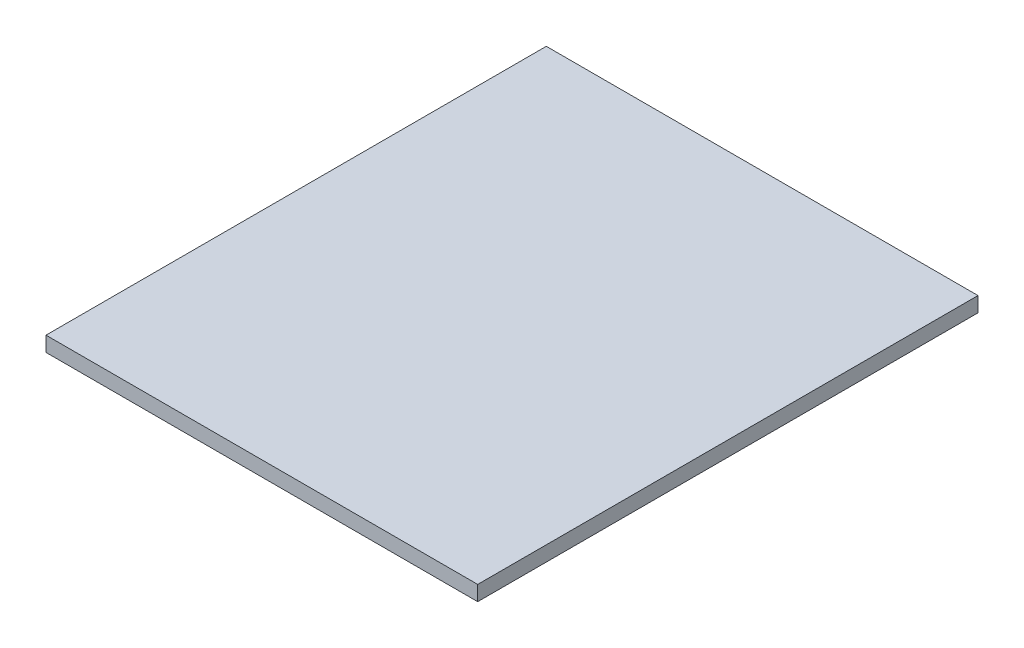
ISO-10303-21;
HEADER;
FILE_DESCRIPTION(('STEP AP214'),'2;1');
FILE_NAME('part.step','',(''),(''),'','','');
FILE_SCHEMA(('AUTOMOTIVE_DESIGN { 1 0 10303 214 1 1 1 1 }'));
ENDSEC;
DATA;
#1=APPLICATION_CONTEXT('core data for automotive mechanical design processes');
#2=APPLICATION_PROTOCOL_DEFINITION('international standard','automotive_design',2000,#1);
#3=PRODUCT_CONTEXT('',#1,'mechanical');
#4=PRODUCT('Part','Part','',(#3));
#5=PRODUCT_RELATED_PRODUCT_CATEGORY('part','',(#4));
#6=PRODUCT_DEFINITION_FORMATION('','',#4);
#7=PRODUCT_DEFINITION_CONTEXT('part definition',#1,'design');
#8=PRODUCT_DEFINITION('design','',#6,#7);
#9=PRODUCT_DEFINITION_SHAPE('','',#8);
#10=(LENGTH_UNIT() NAMED_UNIT(*) SI_UNIT(.MILLI.,.METRE.));
#11=(NAMED_UNIT(*) PLANE_ANGLE_UNIT() SI_UNIT($,.RADIAN.));
#12=(NAMED_UNIT(*) SI_UNIT($,.STERADIAN.) SOLID_ANGLE_UNIT());
#13=UNCERTAINTY_MEASURE_WITH_UNIT(LENGTH_MEASURE(1.E-05),#10,'distance_accuracy_value','');
#14=(GEOMETRIC_REPRESENTATION_CONTEXT(3) GLOBAL_UNCERTAINTY_ASSIGNED_CONTEXT((#13)) GLOBAL_UNIT_ASSIGNED_CONTEXT((#10,
#11,#12)) REPRESENTATION_CONTEXT('',''));
#15=CARTESIAN_POINT('',(0.,0.,0.));
#16=DIRECTION('',(0.,0.,1.));
#17=DIRECTION('',(1.,0.,0.));
#18=AXIS2_PLACEMENT_3D('',#15,#16,#17);
#19=CARTESIAN_POINT('',(0.,1.41224,-47.13986));
#20=DIRECTION('',(1.,0.,0.));
#21=DIRECTION('',(0.,0.,-1.));
#22=AXIS2_PLACEMENT_3D('',#19,#20,#21);
#23=PLANE('',#22);
#24=DIRECTION('',(0.,0.,1.));
#25=VECTOR('',#24,1.);
#26=CARTESIAN_POINT('',(0.,0.,-47.13986));
#27=LINE('',#26,#25);
#28=CARTESIAN_POINT('',(0.,0.,-47.13986));
#29=VERTEX_POINT('',#28);
#30=CARTESIAN_POINT('',(0.,0.,0.));
#31=VERTEX_POINT('',#30);
#32=EDGE_CURVE('E107',#29,#31,#27,.T.);
#33=ORIENTED_EDGE('',*,*,#32,.T.);
#34=DIRECTION('',(0.,-1.,0.));
#35=VECTOR('',#34,1.);
#36=CARTESIAN_POINT('',(0.,1.41224,0.));
#37=LINE('',#36,#35);
#38=CARTESIAN_POINT('',(0.,1.41224,0.));
#39=VERTEX_POINT('',#38);
#40=EDGE_CURVE('E11',#39,#31,#37,.T.);
#41=ORIENTED_EDGE('',*,*,#40,.F.);
#42=DIRECTION('',(0.,0.,1.));
#43=VECTOR('',#42,1.);
#44=CARTESIAN_POINT('',(0.,1.41224,-47.13986));
#45=LINE('',#44,#43);
#46=CARTESIAN_POINT('',(0.,1.41224,-47.13986));
#47=VERTEX_POINT('',#46);
#48=EDGE_CURVE('E91',#47,#39,#45,.T.);
#49=ORIENTED_EDGE('',*,*,#48,.F.);
#50=DIRECTION('',(0.,-1.,0.));
#51=VECTOR('',#50,1.);
#52=CARTESIAN_POINT('',(0.,1.41224,-47.13986));
#53=LINE('',#52,#51);
#54=EDGE_CURVE('E103',#47,#29,#53,.T.);
#55=ORIENTED_EDGE('',*,*,#54,.T.);
#56=EDGE_LOOP('',(#33,#41,#49,#55));
#57=FACE_BOUND('',#56,.T.);
#58=ADVANCED_FACE('F39',(#57),#23,.F.);
#59=CARTESIAN_POINT('',(0.,1.41224,0.));
#60=DIRECTION('',(0.,0.,-1.));
#61=DIRECTION('',(-1.,0.,0.));
#62=AXIS2_PLACEMENT_3D('',#59,#60,#61);
#63=PLANE('',#62);
#64=DIRECTION('',(1.,0.,0.));
#65=VECTOR('',#64,1.);
#66=CARTESIAN_POINT('',(0.,0.,0.));
#67=LINE('',#66,#65);
#68=CARTESIAN_POINT('',(40.67556,0.,0.));
#69=VERTEX_POINT('',#68);
#70=EDGE_CURVE('E96',#31,#69,#67,.T.);
#71=ORIENTED_EDGE('',*,*,#70,.T.);
#72=DIRECTION('',(0.,-1.,0.));
#73=VECTOR('',#72,1.);
#74=CARTESIAN_POINT('',(40.67556,1.41224,0.));
#75=LINE('',#74,#73);
#76=CARTESIAN_POINT('',(40.67556,1.41224,0.));
#77=VERTEX_POINT('',#76);
#78=EDGE_CURVE('E48',#77,#69,#75,.T.);
#79=ORIENTED_EDGE('',*,*,#78,.F.);
#80=DIRECTION('',(1.,0.,0.));
#81=VECTOR('',#80,1.);
#82=CARTESIAN_POINT('',(0.,1.41224,0.));
#83=LINE('',#82,#81);
#84=EDGE_CURVE('E86',#39,#77,#83,.T.);
#85=ORIENTED_EDGE('',*,*,#84,.F.);
#86=ORIENTED_EDGE('',*,*,#40,.T.);
#87=EDGE_LOOP('',(#71,#79,#85,#86));
#88=FACE_BOUND('',#87,.T.);
#89=ADVANCED_FACE('F95',(#88),#63,.F.);
#90=CARTESIAN_POINT('',(40.67556,1.41224,0.));
#91=DIRECTION('',(-1.,0.,0.));
#92=DIRECTION('',(0.,0.,1.));
#93=AXIS2_PLACEMENT_3D('',#90,#91,#92);
#94=PLANE('',#93);
#95=DIRECTION('',(0.,0.,-1.));
#96=VECTOR('',#95,1.);
#97=CARTESIAN_POINT('',(40.67556,0.,0.));
#98=LINE('',#97,#96);
#99=CARTESIAN_POINT('',(40.67556,0.,-47.13986));
#100=VERTEX_POINT('',#99);
#101=EDGE_CURVE('E73',#69,#100,#98,.T.);
#102=ORIENTED_EDGE('',*,*,#101,.T.);
#103=DIRECTION('',(0.,-1.,0.));
#104=VECTOR('',#103,1.);
#105=CARTESIAN_POINT('',(40.67556,1.41224,-47.13986));
#106=LINE('',#105,#104);
#107=CARTESIAN_POINT('',(40.67556,1.41224,-47.13986));
#108=VERTEX_POINT('',#107);
#109=EDGE_CURVE('E98',#108,#100,#106,.T.);
#110=ORIENTED_EDGE('',*,*,#109,.F.);
#111=DIRECTION('',(0.,0.,-1.));
#112=VECTOR('',#111,1.);
#113=CARTESIAN_POINT('',(40.67556,1.41224,0.));
#114=LINE('',#113,#112);
#115=EDGE_CURVE('E89',#77,#108,#114,.T.);
#116=ORIENTED_EDGE('',*,*,#115,.F.);
#117=ORIENTED_EDGE('',*,*,#78,.T.);
#118=EDGE_LOOP('',(#102,#110,#116,#117));
#119=FACE_BOUND('',#118,.T.);
#120=ADVANCED_FACE('F99',(#119),#94,.F.);
#121=CARTESIAN_POINT('',(40.67556,1.41224,-47.13986));
#122=DIRECTION('',(0.,0.,1.));
#123=DIRECTION('',(1.,0.,0.));
#124=AXIS2_PLACEMENT_3D('',#121,#122,#123);
#125=PLANE('',#124);
#126=DIRECTION('',(-1.,0.,0.));
#127=VECTOR('',#126,1.);
#128=CARTESIAN_POINT('',(40.67556,0.,-47.13986));
#129=LINE('',#128,#127);
#130=EDGE_CURVE('E79',#100,#29,#129,.T.);
#131=ORIENTED_EDGE('',*,*,#130,.T.);
#132=ORIENTED_EDGE('',*,*,#54,.F.);
#133=DIRECTION('',(-1.,0.,0.));
#134=VECTOR('',#133,1.);
#135=CARTESIAN_POINT('',(40.67556,1.41224,-47.13986));
#136=LINE('',#135,#134);
#137=EDGE_CURVE('E56',#108,#47,#136,.T.);
#138=ORIENTED_EDGE('',*,*,#137,.F.);
#139=ORIENTED_EDGE('',*,*,#109,.T.);
#140=EDGE_LOOP('',(#131,#132,#138,#139));
#141=FACE_BOUND('',#140,.T.);
#142=ADVANCED_FACE('F120',(#141),#125,.F.);
#143=CARTESIAN_POINT('',(0.,1.41224,0.));
#144=DIRECTION('',(0.,1.,0.));
#145=DIRECTION('',(0.,0.,1.));
#146=AXIS2_PLACEMENT_3D('',#143,#144,#145);
#147=PLANE('',#146);
#148=ORIENTED_EDGE('',*,*,#48,.T.);
#149=ORIENTED_EDGE('',*,*,#84,.T.);
#150=ORIENTED_EDGE('',*,*,#115,.T.);
#151=ORIENTED_EDGE('',*,*,#137,.T.);
#152=EDGE_LOOP('',(#148,#149,#150,#151));
#153=FACE_BOUND('',#152,.T.);
#154=ADVANCED_FACE('F87',(#153),#147,.T.);
#155=CARTESIAN_POINT('',(0.,0.,0.));
#156=DIRECTION('',(0.,1.,0.));
#157=DIRECTION('',(0.,0.,1.));
#158=AXIS2_PLACEMENT_3D('',#155,#156,#157);
#159=PLANE('',#158);
#160=ORIENTED_EDGE('',*,*,#32,.F.);
#161=ORIENTED_EDGE('',*,*,#130,.F.);
#162=ORIENTED_EDGE('',*,*,#101,.F.);
#163=ORIENTED_EDGE('',*,*,#70,.F.);
#164=EDGE_LOOP('',(#160,#161,#162,#163));
#165=FACE_BOUND('',#164,.T.);
#166=ADVANCED_FACE('F123',(#165),#159,.F.);
#167=CLOSED_SHELL('',(#58,#89,#120,#142,#154,#166));
#168=MANIFOLD_SOLID_BREP('B2',#167);
#169=ADVANCED_BREP_SHAPE_REPRESENTATION('',(#18,#168),#14);
#170=SHAPE_DEFINITION_REPRESENTATION(#9,#169);
ENDSEC;
END-ISO-10303-21;
